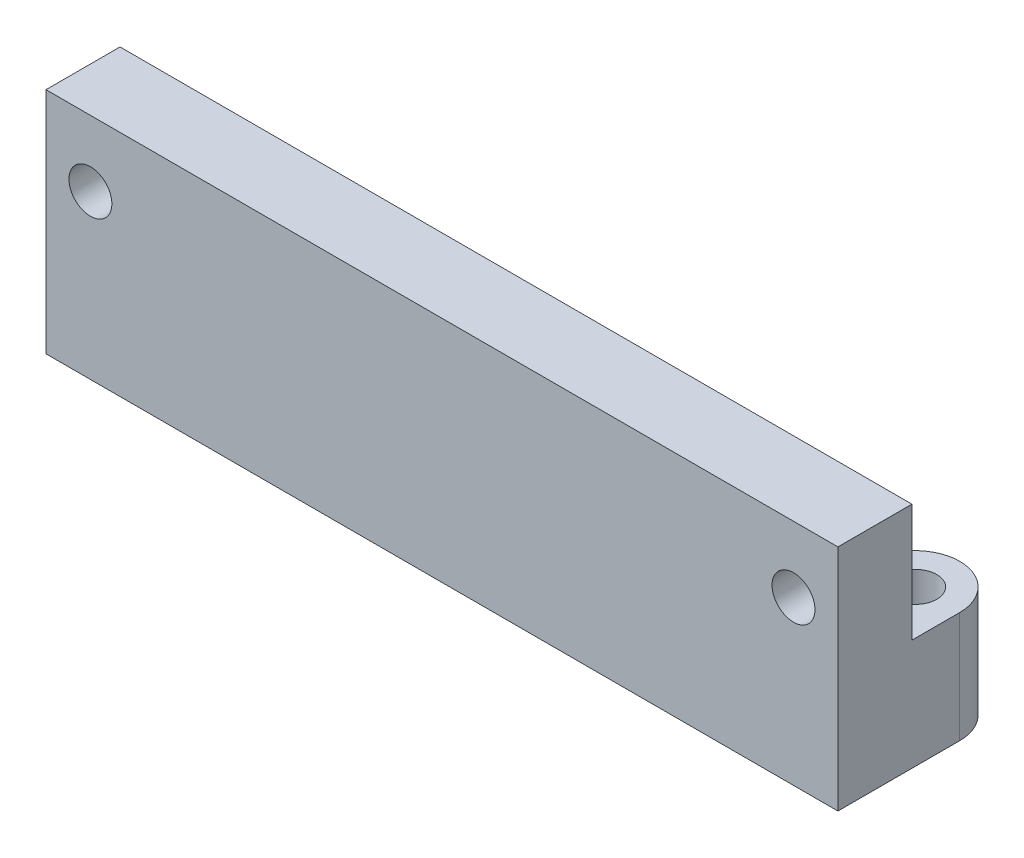
ISO-10303-21;
HEADER;
FILE_DESCRIPTION(('STEP AP214'),'2;1');
FILE_NAME('part.step','',(''),(''),'','','');
FILE_SCHEMA(('AUTOMOTIVE_DESIGN { 1 0 10303 214 1 1 1 1 }'));
ENDSEC;
DATA;
#1=APPLICATION_CONTEXT('core data for automotive mechanical design processes');
#2=APPLICATION_PROTOCOL_DEFINITION('international standard','automotive_design',2000,#1);
#3=PRODUCT_CONTEXT('',#1,'mechanical');
#4=PRODUCT('Part','Part','',(#3));
#5=PRODUCT_RELATED_PRODUCT_CATEGORY('part','',(#4));
#6=PRODUCT_DEFINITION_FORMATION('','',#4);
#7=PRODUCT_DEFINITION_CONTEXT('part definition',#1,'design');
#8=PRODUCT_DEFINITION('design','',#6,#7);
#9=PRODUCT_DEFINITION_SHAPE('','',#8);
#10=(LENGTH_UNIT() NAMED_UNIT(*) SI_UNIT(.MILLI.,.METRE.));
#11=(NAMED_UNIT(*) PLANE_ANGLE_UNIT() SI_UNIT($,.RADIAN.));
#12=(NAMED_UNIT(*) SI_UNIT($,.STERADIAN.) SOLID_ANGLE_UNIT());
#13=UNCERTAINTY_MEASURE_WITH_UNIT(LENGTH_MEASURE(1.E-05),#10,'distance_accuracy_value','');
#14=(GEOMETRIC_REPRESENTATION_CONTEXT(3) GLOBAL_UNCERTAINTY_ASSIGNED_CONTEXT((#13)) GLOBAL_UNIT_ASSIGNED_CONTEXT((#10,
#11,#12)) REPRESENTATION_CONTEXT('',''));
#15=CARTESIAN_POINT('',(0.,0.,0.));
#16=DIRECTION('',(0.,0.,1.));
#17=DIRECTION('',(1.,0.,0.));
#18=AXIS2_PLACEMENT_3D('',#15,#16,#17);
#19=CARTESIAN_POINT('',(-87.8150938682351,15.,-48.957491144606));
#20=DIRECTION('',(0.,1.,0.));
#21=DIRECTION('',(0.,0.,1.));
#22=AXIS2_PLACEMENT_3D('',#19,#20,#21);
#23=PLANE('',#22);
#24=CARTESIAN_POINT('',(-87.8150938682351,15.,-48.957491144606));
#25=DIRECTION('',(0.,1.,0.));
#26=DIRECTION('',(0.,0.,1.));
#27=AXIS2_PLACEMENT_3D('',#24,#25,#26);
#28=CIRCLE('',#27,2.9);
#29=CARTESIAN_POINT('',(-87.8150938682351,15.,-46.057491144606));
#30=VERTEX_POINT('',#29);
#31=EDGE_CURVE('E248',#30,#30,#28,.T.);
#32=ORIENTED_EDGE('',*,*,#31,.F.);
#33=EDGE_LOOP('',(#32));
#34=FACE_BOUND('',#33,.T.);
#35=DIRECTION('',(0.,0.,1.));
#36=VECTOR('',#35,1.);
#37=CARTESIAN_POINT('',(-93.8150938682351,15.,-32.5003513376453));
#38=LINE('',#37,#36);
#39=CARTESIAN_POINT('',(-93.8150938682351,15.,-48.957491144606));
#40=VERTEX_POINT('',#39);
#41=CARTESIAN_POINT('',(-93.8150938682351,15.,-42.5003513376453));
#42=VERTEX_POINT('',#41);
#43=EDGE_CURVE('E126',#40,#42,#38,.T.);
#44=ORIENTED_EDGE('',*,*,#43,.T.);
#45=DIRECTION('',(1.,0.,0.));
#46=VECTOR('',#45,1.);
#47=CARTESIAN_POINT('',(-93.8150938682351,15.,-42.5003513376453));
#48=LINE('',#47,#46);
#49=CARTESIAN_POINT('',(-40.3150938682351,15.,-42.5003513376453));
#50=VERTEX_POINT('',#49);
#51=EDGE_CURVE('E49',#42,#50,#48,.T.);
#52=ORIENTED_EDGE('',*,*,#51,.T.);
#53=CARTESIAN_POINT('',(-40.3150938682351,15.,-179.088842888964));
#54=DIRECTION('',(0.,-1.,0.));
#55=DIRECTION('',(0.,0.,1.));
#56=AXIS2_PLACEMENT_3D('',#53,#54,#55);
#57=CIRCLE('',#56,136.588501371139);
#58=CARTESIAN_POINT('',(-81.8150938682352,15.,-48.957491144606));
#59=VERTEX_POINT('',#58);
#60=EDGE_CURVE('E141',#50,#59,#57,.T.);
#61=ORIENTED_EDGE('',*,*,#60,.T.);
#62=CARTESIAN_POINT('',(-87.8150938682351,15.,-48.957491144606));
#63=DIRECTION('',(0.,1.,0.));
#64=DIRECTION('',(0.,0.,1.));
#65=AXIS2_PLACEMENT_3D('',#62,#63,#64);
#66=CIRCLE('',#65,6.);
#67=EDGE_CURVE('E64',#59,#40,#66,.T.);
#68=ORIENTED_EDGE('',*,*,#67,.T.);
#69=EDGE_LOOP('',(#44,#52,#61,#68));
#70=FACE_BOUND('',#69,.T.);
#71=ADVANCED_FACE('F39',(#34,#70),#23,.T.);
#72=CARTESIAN_POINT('',(7.1849061317649,15.,-48.957491144606));
#73=DIRECTION('',(0.,1.,0.));
#74=DIRECTION('',(0.,0.,1.));
#75=AXIS2_PLACEMENT_3D('',#72,#73,#74);
#76=CIRCLE('',#75,2.9);
#77=CARTESIAN_POINT('',(7.1849061317649,15.,-46.057491144606));
#78=VERTEX_POINT('',#77);
#79=EDGE_CURVE('E261',#78,#78,#76,.T.);
#80=ORIENTED_EDGE('',*,*,#79,.F.);
#81=EDGE_LOOP('',(#80));
#82=FACE_BOUND('',#81,.T.);
#83=CARTESIAN_POINT('',(1.1849061317649,15.,-48.957491144606));
#84=VERTEX_POINT('',#83);
#85=EDGE_CURVE('E142',#84,#50,#57,.T.);
#86=ORIENTED_EDGE('',*,*,#85,.T.);
#87=CARTESIAN_POINT('',(13.1849061317649,15.,-42.5003513376453));
#88=VERTEX_POINT('',#87);
#89=EDGE_CURVE('E11',#50,#88,#48,.T.);
#90=ORIENTED_EDGE('',*,*,#89,.T.);
#91=DIRECTION('',(0.,0.,-1.));
#92=VECTOR('',#91,1.);
#93=CARTESIAN_POINT('',(13.1849061317649,15.,-32.5003513376453));
#94=LINE('',#93,#92);
#95=CARTESIAN_POINT('',(13.1849061317649,15.,-48.957491144606));
#96=VERTEX_POINT('',#95);
#97=EDGE_CURVE('E98',#88,#96,#94,.T.);
#98=ORIENTED_EDGE('',*,*,#97,.T.);
#99=CARTESIAN_POINT('',(7.1849061317649,15.,-48.957491144606));
#100=DIRECTION('',(0.,1.,0.));
#101=DIRECTION('',(0.,0.,1.));
#102=AXIS2_PLACEMENT_3D('',#99,#100,#101);
#103=CIRCLE('',#102,6.);
#104=EDGE_CURVE('E132',#96,#84,#103,.T.);
#105=ORIENTED_EDGE('',*,*,#104,.T.);
#106=EDGE_LOOP('',(#86,#90,#98,#105));
#107=FACE_BOUND('',#106,.T.);
#108=ADVANCED_FACE('F185',(#82,#107),#23,.T.);
#109=CARTESIAN_POINT('',(-93.8150938682351,15.,-32.5003513376453));
#110=DIRECTION('',(1.,0.,0.));
#111=DIRECTION('',(0.,0.,-1.));
#112=AXIS2_PLACEMENT_3D('',#109,#110,#111);
#113=PLANE('',#112);
#114=DIRECTION('',(0.,0.,1.));
#115=VECTOR('',#114,1.);
#116=CARTESIAN_POINT('',(-93.8150938682351,0.,-32.5003513376453));
#117=LINE('',#116,#115);
#118=CARTESIAN_POINT('',(-93.8150938682351,0.,-48.957491144606));
#119=VERTEX_POINT('',#118);
#120=CARTESIAN_POINT('',(-93.8150938682351,0.,-32.5003513376453));
#121=VERTEX_POINT('',#120);
#122=EDGE_CURVE('E147',#119,#121,#117,.T.);
#123=ORIENTED_EDGE('',*,*,#122,.T.);
#124=DIRECTION('',(0.,-1.,0.));
#125=VECTOR('',#124,1.);
#126=CARTESIAN_POINT('',(-93.8150938682351,15.,-32.5003513376453));
#127=LINE('',#126,#125);
#128=CARTESIAN_POINT('',(-93.8150938682351,30.910870519808,-32.5003513376453));
#129=VERTEX_POINT('',#128);
#130=EDGE_CURVE('E43',#129,#121,#127,.T.);
#131=ORIENTED_EDGE('',*,*,#130,.F.);
#132=DIRECTION('',(0.,0.,1.));
#133=VECTOR('',#132,1.);
#134=CARTESIAN_POINT('',(-93.8150938682351,30.910870519808,-42.5003513376453));
#135=LINE('',#134,#133);
#136=CARTESIAN_POINT('',(-93.8150938682351,30.910870519808,-42.5003513376453));
#137=VERTEX_POINT('',#136);
#138=EDGE_CURVE('E128',#137,#129,#135,.T.);
#139=ORIENTED_EDGE('',*,*,#138,.F.);
#140=DIRECTION('',(0.,-1.,0.));
#141=VECTOR('',#140,1.);
#142=CARTESIAN_POINT('',(-93.8150938682351,30.910870519808,-42.5003513376453));
#143=LINE('',#142,#141);
#144=EDGE_CURVE('E120',#137,#42,#143,.T.);
#145=ORIENTED_EDGE('',*,*,#144,.T.);
#146=ORIENTED_EDGE('',*,*,#43,.F.);
#147=DIRECTION('',(0.,-1.,0.));
#148=VECTOR('',#147,1.);
#149=CARTESIAN_POINT('',(-93.8150938682351,15.,-48.957491144606));
#150=LINE('',#149,#148);
#151=EDGE_CURVE('E146',#40,#119,#150,.T.);
#152=ORIENTED_EDGE('',*,*,#151,.T.);
#153=EDGE_LOOP('',(#123,#131,#139,#145,#146,#152));
#154=FACE_BOUND('',#153,.T.);
#155=ADVANCED_FACE('F41',(#154),#113,.F.);
#156=CARTESIAN_POINT('',(13.1849061317649,15.,-32.5003513376453));
#157=DIRECTION('',(0.,0.,-1.));
#158=DIRECTION('',(-1.,0.,0.));
#159=AXIS2_PLACEMENT_3D('',#156,#157,#158);
#160=PLANE('',#159);
#161=CARTESIAN_POINT('',(7.18490613176489,22.,-32.5003513376453));
#162=DIRECTION('',(0.,0.,-1.));
#163=DIRECTION('',(-1.,0.,0.));
#164=AXIS2_PLACEMENT_3D('',#161,#162,#163);
#165=CIRCLE('',#164,2.9);
#166=CARTESIAN_POINT('',(4.28490613176489,22.,-32.5003513376453));
#167=VERTEX_POINT('',#166);
#168=EDGE_CURVE('E246',#167,#167,#165,.T.);
#169=ORIENTED_EDGE('',*,*,#168,.T.);
#170=EDGE_LOOP('',(#169));
#171=FACE_BOUND('',#170,.T.);
#172=CARTESIAN_POINT('',(-87.8150938682352,22.,-32.5003513376453));
#173=DIRECTION('',(0.,0.,-1.));
#174=DIRECTION('',(-1.,0.,0.));
#175=AXIS2_PLACEMENT_3D('',#172,#173,#174);
#176=CIRCLE('',#175,2.9);
#177=CARTESIAN_POINT('',(-90.7150938682352,22.,-32.5003513376453));
#178=VERTEX_POINT('',#177);
#179=EDGE_CURVE('E249',#178,#178,#176,.T.);
#180=ORIENTED_EDGE('',*,*,#179,.T.);
#181=EDGE_LOOP('',(#180));
#182=FACE_BOUND('',#181,.T.);
#183=DIRECTION('',(1.,0.,0.));
#184=VECTOR('',#183,1.);
#185=CARTESIAN_POINT('',(13.1849061317649,0.,-32.5003513376453));
#186=LINE('',#185,#184);
#187=CARTESIAN_POINT('',(13.1849061317649,0.,-32.5003513376453));
#188=VERTEX_POINT('',#187);
#189=EDGE_CURVE('E149',#121,#188,#186,.T.);
#190=ORIENTED_EDGE('',*,*,#189,.T.);
#191=DIRECTION('',(0.,-1.,0.));
#192=VECTOR('',#191,1.);
#193=CARTESIAN_POINT('',(13.1849061317649,15.,-32.5003513376453));
#194=LINE('',#193,#192);
#195=CARTESIAN_POINT('',(13.1849061317649,30.910870519808,-32.5003513376453));
#196=VERTEX_POINT('',#195);
#197=EDGE_CURVE('E164',#196,#188,#194,.T.);
#198=ORIENTED_EDGE('',*,*,#197,.F.);
#199=DIRECTION('',(-1.,0.,0.));
#200=VECTOR('',#199,1.);
#201=CARTESIAN_POINT('',(13.1849061317649,30.910870519808,-32.5003513376453));
#202=LINE('',#201,#200);
#203=EDGE_CURVE('E129',#196,#129,#202,.T.);
#204=ORIENTED_EDGE('',*,*,#203,.T.);
#205=ORIENTED_EDGE('',*,*,#130,.T.);
#206=EDGE_LOOP('',(#190,#198,#204,#205));
#207=FACE_BOUND('',#206,.T.);
#208=ADVANCED_FACE('F172',(#171,#182,#207),#160,.F.);
#209=CARTESIAN_POINT('',(13.1849061317649,15.,-32.5003513376453));
#210=DIRECTION('',(-1.,0.,0.));
#211=DIRECTION('',(0.,0.,1.));
#212=AXIS2_PLACEMENT_3D('',#209,#210,#211);
#213=PLANE('',#212);
#214=DIRECTION('',(0.,0.,-1.));
#215=VECTOR('',#214,1.);
#216=CARTESIAN_POINT('',(13.1849061317649,0.,-32.5003513376453));
#217=LINE('',#216,#215);
#218=CARTESIAN_POINT('',(13.1849061317649,0.,-48.957491144606));
#219=VERTEX_POINT('',#218);
#220=EDGE_CURVE('E151',#188,#219,#217,.T.);
#221=ORIENTED_EDGE('',*,*,#220,.T.);
#222=DIRECTION('',(0.,-1.,0.));
#223=VECTOR('',#222,1.);
#224=CARTESIAN_POINT('',(13.1849061317649,15.,-48.957491144606));
#225=LINE('',#224,#223);
#226=EDGE_CURVE('E162',#96,#219,#225,.T.);
#227=ORIENTED_EDGE('',*,*,#226,.F.);
#228=ORIENTED_EDGE('',*,*,#97,.F.);
#229=DIRECTION('',(0.,1.,0.));
#230=VECTOR('',#229,1.);
#231=CARTESIAN_POINT('',(13.1849061317649,15.,-42.5003513376453));
#232=LINE('',#231,#230);
#233=CARTESIAN_POINT('',(13.1849061317649,30.910870519808,-42.5003513376453));
#234=VERTEX_POINT('',#233);
#235=EDGE_CURVE('E56',#88,#234,#232,.T.);
#236=ORIENTED_EDGE('',*,*,#235,.T.);
#237=DIRECTION('',(0.,0.,1.));
#238=VECTOR('',#237,1.);
#239=CARTESIAN_POINT('',(13.1849061317649,30.910870519808,-42.5003513376453));
#240=LINE('',#239,#238);
#241=EDGE_CURVE('E137',#234,#196,#240,.T.);
#242=ORIENTED_EDGE('',*,*,#241,.T.);
#243=ORIENTED_EDGE('',*,*,#197,.T.);
#244=EDGE_LOOP('',(#221,#227,#228,#236,#242,#243));
#245=FACE_BOUND('',#244,.T.);
#246=ADVANCED_FACE('F179',(#245),#213,.F.);
#247=CARTESIAN_POINT('',(7.1849061317649,15.,-48.957491144606));
#248=DIRECTION('',(0.,-1.,0.));
#249=DIRECTION('',(0.,0.,-1.));
#250=AXIS2_PLACEMENT_3D('',#247,#248,#249);
#251=CYLINDRICAL_SURFACE('',#250,6.);
#252=CARTESIAN_POINT('',(7.1849061317649,0.,-48.957491144606));
#253=DIRECTION('',(0.,1.,0.));
#254=DIRECTION('',(0.,0.,1.));
#255=AXIS2_PLACEMENT_3D('',#252,#253,#254);
#256=CIRCLE('',#255,6.);
#257=CARTESIAN_POINT('',(1.1849061317649,0.,-48.957491144606));
#258=VERTEX_POINT('',#257);
#259=EDGE_CURVE('E153',#219,#258,#256,.T.);
#260=ORIENTED_EDGE('',*,*,#259,.T.);
#261=DIRECTION('',(0.,-1.,0.));
#262=VECTOR('',#261,1.);
#263=CARTESIAN_POINT('',(1.1849061317649,15.,-48.957491144606));
#264=LINE('',#263,#262);
#265=EDGE_CURVE('E159',#84,#258,#264,.T.);
#266=ORIENTED_EDGE('',*,*,#265,.F.);
#267=ORIENTED_EDGE('',*,*,#104,.F.);
#268=ORIENTED_EDGE('',*,*,#226,.T.);
#269=EDGE_LOOP('',(#260,#266,#267,#268));
#270=FACE_BOUND('',#269,.T.);
#271=ADVANCED_FACE('F182',(#270),#251,.T.);
#272=CARTESIAN_POINT('',(-40.3150938682351,15.,-179.088842888964));
#273=DIRECTION('',(0.,-1.,0.));
#274=DIRECTION('',(0.,0.,-1.));
#275=AXIS2_PLACEMENT_3D('',#272,#273,#274);
#276=CYLINDRICAL_SURFACE('',#275,136.588501371139);
#277=CARTESIAN_POINT('',(-40.3150938682351,0.,-179.088842888964));
#278=DIRECTION('',(0.,-1.,0.));
#279=DIRECTION('',(0.,0.,1.));
#280=AXIS2_PLACEMENT_3D('',#277,#278,#279);
#281=CIRCLE('',#280,136.588501371139);
#282=CARTESIAN_POINT('',(-81.8150938682352,0.,-48.957491144606));
#283=VERTEX_POINT('',#282);
#284=EDGE_CURVE('E134',#258,#283,#281,.T.);
#285=ORIENTED_EDGE('',*,*,#284,.T.);
#286=DIRECTION('',(0.,-1.,0.));
#287=VECTOR('',#286,1.);
#288=CARTESIAN_POINT('',(-81.8150938682352,15.,-48.957491144606));
#289=LINE('',#288,#287);
#290=EDGE_CURVE('E157',#59,#283,#289,.T.);
#291=ORIENTED_EDGE('',*,*,#290,.F.);
#292=ORIENTED_EDGE('',*,*,#60,.F.);
#293=ORIENTED_EDGE('',*,*,#85,.F.);
#294=ORIENTED_EDGE('',*,*,#265,.T.);
#295=EDGE_LOOP('',(#285,#291,#292,#293,#294));
#296=FACE_BOUND('',#295,.T.);
#297=ADVANCED_FACE('F187',(#296),#276,.F.);
#298=CARTESIAN_POINT('',(-87.8150938682351,15.,-48.957491144606));
#299=DIRECTION('',(0.,-1.,0.));
#300=DIRECTION('',(0.,0.,-1.));
#301=AXIS2_PLACEMENT_3D('',#298,#299,#300);
#302=CYLINDRICAL_SURFACE('',#301,6.);
#303=CARTESIAN_POINT('',(-87.8150938682351,0.,-48.957491144606));
#304=DIRECTION('',(0.,1.,0.));
#305=DIRECTION('',(0.,0.,1.));
#306=AXIS2_PLACEMENT_3D('',#303,#304,#305);
#307=CIRCLE('',#306,6.);
#308=EDGE_CURVE('E91',#283,#119,#307,.T.);
#309=ORIENTED_EDGE('',*,*,#308,.T.);
#310=ORIENTED_EDGE('',*,*,#151,.F.);
#311=ORIENTED_EDGE('',*,*,#67,.F.);
#312=ORIENTED_EDGE('',*,*,#290,.T.);
#313=EDGE_LOOP('',(#309,#310,#311,#312));
#314=FACE_BOUND('',#313,.T.);
#315=ADVANCED_FACE('F189',(#314),#302,.T.);
#316=CARTESIAN_POINT('',(-87.8150938682351,0.,-48.957491144606));
#317=DIRECTION('',(0.,1.,0.));
#318=DIRECTION('',(0.,0.,1.));
#319=AXIS2_PLACEMENT_3D('',#316,#317,#318);
#320=PLANE('',#319);
#321=ORIENTED_EDGE('',*,*,#122,.F.);
#322=ORIENTED_EDGE('',*,*,#308,.F.);
#323=ORIENTED_EDGE('',*,*,#284,.F.);
#324=ORIENTED_EDGE('',*,*,#259,.F.);
#325=ORIENTED_EDGE('',*,*,#220,.F.);
#326=ORIENTED_EDGE('',*,*,#189,.F.);
#327=EDGE_LOOP('',(#321,#322,#323,#324,#325,#326));
#328=FACE_BOUND('',#327,.T.);
#329=ADVANCED_FACE('F176',(#328),#320,.F.);
#330=CARTESIAN_POINT('',(13.1849061317649,30.910870519808,-42.5003513376453));
#331=DIRECTION('',(0.,1.,0.));
#332=DIRECTION('',(-1.,0.,0.));
#333=AXIS2_PLACEMENT_3D('',#330,#331,#332);
#334=PLANE('',#333);
#335=ORIENTED_EDGE('',*,*,#203,.F.);
#336=ORIENTED_EDGE('',*,*,#241,.F.);
#337=DIRECTION('',(-1.,0.,0.));
#338=VECTOR('',#337,1.);
#339=CARTESIAN_POINT('',(13.1849061317649,30.910870519808,-42.5003513376453));
#340=LINE('',#339,#338);
#341=EDGE_CURVE('E267',#234,#137,#340,.T.);
#342=ORIENTED_EDGE('',*,*,#341,.T.);
#343=ORIENTED_EDGE('',*,*,#138,.T.);
#344=EDGE_LOOP('',(#335,#336,#342,#343));
#345=FACE_BOUND('',#344,.T.);
#346=ADVANCED_FACE('F196',(#345),#334,.T.);
#347=CARTESIAN_POINT('',(0.,0.,-42.5003513376453));
#348=DIRECTION('',(0.,0.,1.));
#349=DIRECTION('',(1.,0.,0.));
#350=AXIS2_PLACEMENT_3D('',#347,#348,#349);
#351=PLANE('',#350);
#352=CARTESIAN_POINT('',(7.18490613176489,22.,-42.5003513376453));
#353=DIRECTION('',(0.,0.,-1.));
#354=DIRECTION('',(-1.,0.,0.));
#355=AXIS2_PLACEMENT_3D('',#352,#353,#354);
#356=CIRCLE('',#355,2.9);
#357=CARTESIAN_POINT('',(4.28490613176489,22.,-42.5003513376453));
#358=VERTEX_POINT('',#357);
#359=EDGE_CURVE('E243',#358,#358,#356,.T.);
#360=ORIENTED_EDGE('',*,*,#359,.F.);
#361=EDGE_LOOP('',(#360));
#362=FACE_BOUND('',#361,.T.);
#363=CARTESIAN_POINT('',(-87.8150938682352,22.,-42.5003513376453));
#364=DIRECTION('',(0.,0.,-1.));
#365=DIRECTION('',(1.,0.,0.));
#366=AXIS2_PLACEMENT_3D('',#363,#364,#365);
#367=CIRCLE('',#366,2.9);
#368=CARTESIAN_POINT('',(-84.9150938682352,22.,-42.5003513376453));
#369=VERTEX_POINT('',#368);
#370=EDGE_CURVE('E274',#369,#369,#367,.T.);
#371=ORIENTED_EDGE('',*,*,#370,.F.);
#372=EDGE_LOOP('',(#371));
#373=FACE_BOUND('',#372,.T.);
#374=ORIENTED_EDGE('',*,*,#144,.F.);
#375=ORIENTED_EDGE('',*,*,#341,.F.);
#376=ORIENTED_EDGE('',*,*,#235,.F.);
#377=ORIENTED_EDGE('',*,*,#89,.F.);
#378=ORIENTED_EDGE('',*,*,#51,.F.);
#379=EDGE_LOOP('',(#374,#375,#376,#377,#378));
#380=FACE_BOUND('',#379,.T.);
#381=ADVANCED_FACE('F119',(#362,#373,#380),#351,.F.);
#382=CARTESIAN_POINT('',(7.1849061317649,2.5,-48.957491144606));
#383=DIRECTION('',(0.,1.,0.));
#384=DIRECTION('',(0.,0.,1.));
#385=AXIS2_PLACEMENT_3D('',#382,#383,#384);
#386=CYLINDRICAL_SURFACE('',#385,2.9);
#387=CARTESIAN_POINT('',(7.1849061317649,2.5,-48.957491144606));
#388=DIRECTION('',(0.,1.,0.));
#389=DIRECTION('',(0.,0.,1.));
#390=AXIS2_PLACEMENT_3D('',#387,#388,#389);
#391=CIRCLE('',#390,2.9);
#392=CARTESIAN_POINT('',(7.1849061317649,2.5,-46.057491144606));
#393=VERTEX_POINT('',#392);
#394=EDGE_CURVE('E258',#393,#393,#391,.T.);
#395=ORIENTED_EDGE('',*,*,#394,.F.);
#396=EDGE_LOOP('',(#395));
#397=FACE_BOUND('',#396,.T.);
#398=ORIENTED_EDGE('',*,*,#79,.T.);
#399=EDGE_LOOP('',(#398));
#400=FACE_BOUND('',#399,.T.);
#401=ADVANCED_FACE('F214',(#397,#400),#386,.F.);
#402=CARTESIAN_POINT('',(7.1849061317649,2.5,-48.957491144606));
#403=DIRECTION('',(0.,1.,0.));
#404=DIRECTION('',(0.,0.,1.));
#405=AXIS2_PLACEMENT_3D('',#402,#403,#404);
#406=PLANE('',#405);
#407=ORIENTED_EDGE('',*,*,#394,.T.);
#408=EDGE_LOOP('',(#407));
#409=FACE_BOUND('',#408,.T.);
#410=ADVANCED_FACE('F220',(#409),#406,.T.);
#411=CARTESIAN_POINT('',(-87.8150938682351,2.5,-48.957491144606));
#412=DIRECTION('',(0.,1.,0.));
#413=DIRECTION('',(0.,0.,1.));
#414=AXIS2_PLACEMENT_3D('',#411,#412,#413);
#415=CYLINDRICAL_SURFACE('',#414,2.9);
#416=CARTESIAN_POINT('',(-87.8150938682351,2.5,-48.957491144606));
#417=DIRECTION('',(0.,1.,0.));
#418=DIRECTION('',(0.,0.,1.));
#419=AXIS2_PLACEMENT_3D('',#416,#417,#418);
#420=CIRCLE('',#419,2.9);
#421=CARTESIAN_POINT('',(-87.8150938682351,2.5,-46.057491144606));
#422=VERTEX_POINT('',#421);
#423=EDGE_CURVE('E252',#422,#422,#420,.T.);
#424=ORIENTED_EDGE('',*,*,#423,.F.);
#425=EDGE_LOOP('',(#424));
#426=FACE_BOUND('',#425,.T.);
#427=ORIENTED_EDGE('',*,*,#31,.T.);
#428=EDGE_LOOP('',(#427));
#429=FACE_BOUND('',#428,.T.);
#430=ADVANCED_FACE('F216',(#426,#429),#415,.F.);
#431=CARTESIAN_POINT('',(-87.8150938682351,2.5,-48.957491144606));
#432=DIRECTION('',(0.,1.,0.));
#433=DIRECTION('',(0.,0.,1.));
#434=AXIS2_PLACEMENT_3D('',#431,#432,#433);
#435=PLANE('',#434);
#436=ORIENTED_EDGE('',*,*,#423,.T.);
#437=EDGE_LOOP('',(#436));
#438=FACE_BOUND('',#437,.T.);
#439=ADVANCED_FACE('F219',(#438),#435,.T.);
#440=CARTESIAN_POINT('',(-87.8150938682352,22.,-30.0003513376453));
#441=DIRECTION('',(0.,0.,-1.));
#442=DIRECTION('',(-1.,0.,0.));
#443=AXIS2_PLACEMENT_3D('',#440,#441,#442);
#444=CYLINDRICAL_SURFACE('',#443,2.9);
#445=ORIENTED_EDGE('',*,*,#370,.T.);
#446=EDGE_LOOP('',(#445));
#447=FACE_BOUND('',#446,.T.);
#448=ORIENTED_EDGE('',*,*,#179,.F.);
#449=EDGE_LOOP('',(#448));
#450=FACE_BOUND('',#449,.T.);
#451=ADVANCED_FACE('F224',(#447,#450),#444,.F.);
#452=CARTESIAN_POINT('',(7.18490613176489,22.,-30.0003513376453));
#453=DIRECTION('',(0.,0.,-1.));
#454=DIRECTION('',(-1.,0.,0.));
#455=AXIS2_PLACEMENT_3D('',#452,#453,#454);
#456=CYLINDRICAL_SURFACE('',#455,2.9);
#457=ORIENTED_EDGE('',*,*,#359,.T.);
#458=EDGE_LOOP('',(#457));
#459=FACE_BOUND('',#458,.T.);
#460=ORIENTED_EDGE('',*,*,#168,.F.);
#461=EDGE_LOOP('',(#460));
#462=FACE_BOUND('',#461,.T.);
#463=ADVANCED_FACE('F234',(#459,#462),#456,.F.);
#464=CLOSED_SHELL('',(#71,#108,#155,#208,#246,#271,#297,#315,#329,#346,#381,#401,#410,#430,#439,
#451,#463));
#465=MANIFOLD_SOLID_BREP('B2',#464);
#466=ADVANCED_BREP_SHAPE_REPRESENTATION('',(#18,#465),#14);
#467=SHAPE_DEFINITION_REPRESENTATION(#9,#466);
ENDSEC;
END-ISO-10303-21;
